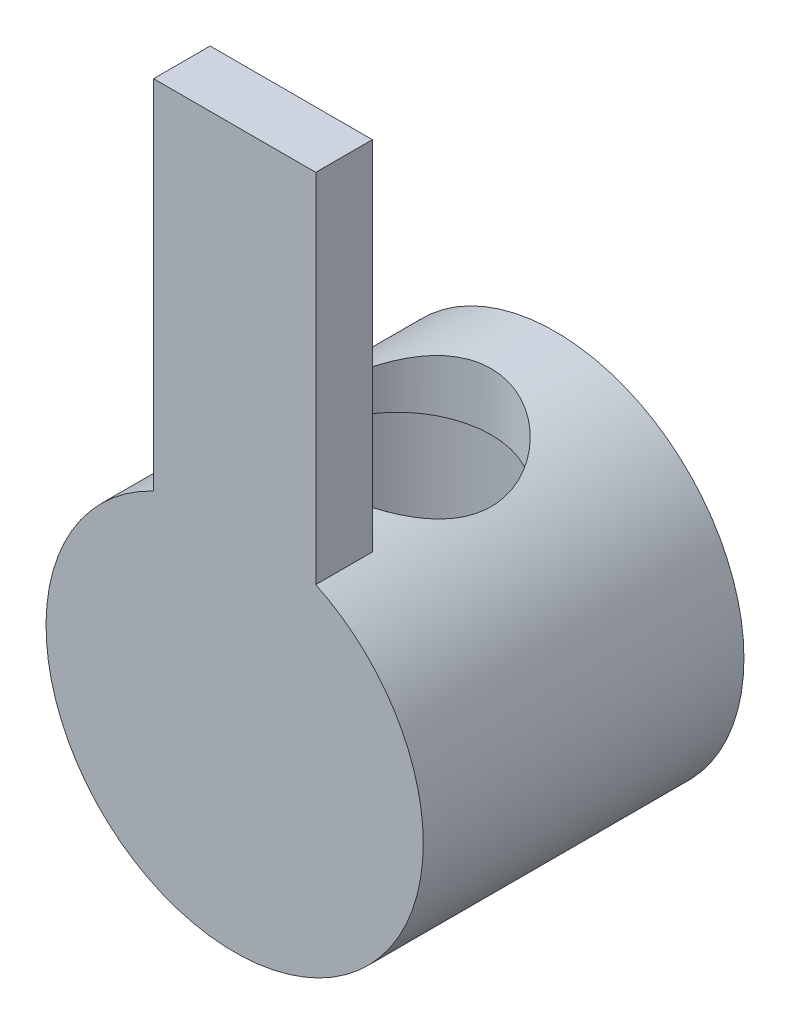
ISO-10303-21;
HEADER;
FILE_DESCRIPTION(('STEP AP214'),'2;1');
FILE_NAME('part.step','',(''),(''),'','','');
FILE_SCHEMA(('AUTOMOTIVE_DESIGN { 1 0 10303 214 1 1 1 1 }'));
ENDSEC;
DATA;
#1=APPLICATION_CONTEXT('core data for automotive mechanical design processes');
#2=APPLICATION_PROTOCOL_DEFINITION('international standard','automotive_design',2000,#1);
#3=PRODUCT_CONTEXT('',#1,'mechanical');
#4=PRODUCT('Part','Part','',(#3));
#5=PRODUCT_RELATED_PRODUCT_CATEGORY('part','',(#4));
#6=PRODUCT_DEFINITION_FORMATION('','',#4);
#7=PRODUCT_DEFINITION_CONTEXT('part definition',#1,'design');
#8=PRODUCT_DEFINITION('design','',#6,#7);
#9=PRODUCT_DEFINITION_SHAPE('','',#8);
#10=(LENGTH_UNIT() NAMED_UNIT(*) SI_UNIT(.MILLI.,.METRE.));
#11=(NAMED_UNIT(*) PLANE_ANGLE_UNIT() SI_UNIT($,.RADIAN.));
#12=(NAMED_UNIT(*) SI_UNIT($,.STERADIAN.) SOLID_ANGLE_UNIT());
#13=UNCERTAINTY_MEASURE_WITH_UNIT(LENGTH_MEASURE(1.E-05),#10,'distance_accuracy_value','');
#14=(GEOMETRIC_REPRESENTATION_CONTEXT(3) GLOBAL_UNCERTAINTY_ASSIGNED_CONTEXT((#13)) GLOBAL_UNIT_ASSIGNED_CONTEXT((#10,
#11,#12)) REPRESENTATION_CONTEXT('',''));
#15=CARTESIAN_POINT('',(0.,0.,0.));
#16=DIRECTION('',(0.,0.,1.));
#17=DIRECTION('',(1.,0.,0.));
#18=AXIS2_PLACEMENT_3D('',#15,#16,#17);
#19=CARTESIAN_POINT('',(0.,-4.98,-7.));
#20=DIRECTION('',(0.,0.,1.));
#21=DIRECTION('',(1.,0.,0.));
#22=AXIS2_PLACEMENT_3D('',#19,#20,#21);
#23=CYLINDRICAL_SURFACE('',#22,5.);
#24=DIRECTION('',(0.,0.,1.));
#25=VECTOR('',#24,1.);
#26=CARTESIAN_POINT('',(2.15,-0.465855562789334,-7.));
#27=LINE('',#26,#25);
#28=CARTESIAN_POINT('',(2.15,-0.465855562789334,1.5));
#29=VERTEX_POINT('',#28);
#30=CARTESIAN_POINT('',(2.15,-0.465855562789334,0.));
#31=VERTEX_POINT('',#30);
#32=EDGE_CURVE('E81',#29,#31,#27,.F.);
#33=ORIENTED_EDGE('',*,*,#32,.F.);
#34=CARTESIAN_POINT('',(0.,-4.98,1.5));
#35=DIRECTION('',(0.,0.,1.));
#36=DIRECTION('',(1.,0.,0.));
#37=AXIS2_PLACEMENT_3D('',#34,#35,#36);
#38=CIRCLE('',#37,5.);
#39=CARTESIAN_POINT('',(-2.15,-0.465855562789334,1.5));
#40=VERTEX_POINT('',#39);
#41=EDGE_CURVE('E84',#40,#29,#38,.T.);
#42=ORIENTED_EDGE('',*,*,#41,.F.);
#43=DIRECTION('',(0.,0.,1.));
#44=VECTOR('',#43,1.);
#45=CARTESIAN_POINT('',(-2.15,-0.465855562789334,-7.));
#46=LINE('',#45,#44);
#47=CARTESIAN_POINT('',(-2.15,-0.465855562789334,0.));
#48=VERTEX_POINT('',#47);
#49=EDGE_CURVE('E87',#48,#40,#46,.T.);
#50=ORIENTED_EDGE('',*,*,#49,.F.);
#51=CARTESIAN_POINT('',(0.,-4.98,0.));
#52=DIRECTION('',(0.,0.,-1.));
#53=DIRECTION('',(-1.,0.,0.));
#54=AXIS2_PLACEMENT_3D('',#51,#52,#53);
#55=CIRCLE('',#54,5.);
#56=EDGE_CURVE('E11',#48,#31,#55,.T.);
#57=ORIENTED_EDGE('',*,*,#56,.T.);
#58=EDGE_LOOP('',(#33,#42,#50,#57));
#59=FACE_BOUND('',#58,.T.);
#60=CARTESIAN_POINT('',(0.,-4.98,-7.));
#61=DIRECTION('',(0.,0.,1.));
#62=DIRECTION('',(1.,0.,0.));
#63=AXIS2_PLACEMENT_3D('',#60,#61,#62);
#64=CIRCLE('',#63,5.);
#65=CARTESIAN_POINT('',(5.,-4.98,-7.));
#66=VERTEX_POINT('',#65);
#67=EDGE_CURVE('E93',#66,#66,#64,.T.);
#68=ORIENTED_EDGE('',*,*,#67,.T.);
#69=EDGE_LOOP('',(#68));
#70=FACE_BOUND('',#69,.T.);
#71=CARTESIAN_POINT('',(0.,0.0200000000000001,-0.3));
#72=CARTESIAN_POINT('',(0.131426682334304,0.0199917755047177,-0.300009669056007));
#73=CARTESIAN_POINT('',(0.263015634437212,0.0147619913527734,-0.31042556177403));
#74=CARTESIAN_POINT('',(0.522301454622882,-0.00564581438980243,-0.35163182116205));
#75=CARTESIAN_POINT('',(0.649990448564105,-0.0208427281232976,-0.38246088092502));
#76=CARTESIAN_POINT('',(0.897333631316203,-0.0595930907752331,-0.462984622718842));
#77=CARTESIAN_POINT('',(1.01701694536277,-0.0831140409274075,-0.512605987782728));
#78=CARTESIAN_POINT('',(1.24618160399671,-0.136355566741728,-0.628926526251796));
#79=CARTESIAN_POINT('',(1.3556637520377,-0.166075653555792,-0.695624353145094));
#80=CARTESIAN_POINT('',(1.56876952630998,-0.231093549493683,-0.848793131642628));
#81=CARTESIAN_POINT('',(1.67163802294308,-0.266620023409093,-0.936216200229782));
#82=CARTESIAN_POINT('',(1.86194861703333,-0.338500742232692,-1.12630369598529));
#83=CARTESIAN_POINT('',(1.94937895911555,-0.374855594331026,-1.22897962884011));
#84=CARTESIAN_POINT('',(2.11312999967247,-0.447526220543785,-1.45620837444528));
#85=CARTESIAN_POINT('',(2.18806333849064,-0.483620325874333,-1.58184024603501));
#86=CARTESIAN_POINT('',(2.31542056761491,-0.54785053056445,-1.84591833979543));
#87=CARTESIAN_POINT('',(2.36786053751682,-0.575992309792079,-1.98435532176262));
#88=CARTESIAN_POINT('',(2.44533110537653,-0.618553324085982,-2.26166276359641));
#89=CARTESIAN_POINT('',(2.47181464267578,-0.633693210415482,-2.40001113017958));
#90=CARTESIAN_POINT('',(2.50106748329741,-0.650452751278497,-2.67994709443761));
#91=CARTESIAN_POINT('',(2.50386022093906,-0.652085766415702,-2.82153135217509));
#92=CARTESIAN_POINT('',(2.48671821792512,-0.642226743570632,-3.08571506079088));
#93=CARTESIAN_POINT('',(2.46946139884055,-0.632280908450156,-3.20856007805829));
#94=CARTESIAN_POINT('',(2.41734962264384,-0.603094281653247,-3.44930477343195));
#95=CARTESIAN_POINT('',(2.38248905974454,-0.583850529205458,-3.56720286326311));
#96=CARTESIAN_POINT('',(2.29552445096459,-0.537813089681611,-3.79807283141433));
#97=CARTESIAN_POINT('',(2.24303766778987,-0.510853983400073,-3.91086599696452));
#98=CARTESIAN_POINT('',(2.12260421917012,-0.452414892964872,-4.12658573147497));
#99=CARTESIAN_POINT('',(2.0546506095312,-0.420932880495225,-4.22950783900021));
#100=CARTESIAN_POINT('',(1.89516513728194,-0.352171052417867,-4.43630313185808));
#101=CARTESIAN_POINT('',(1.80173614592319,-0.314662244081351,-4.5386421839404));
#102=CARTESIAN_POINT('',(1.59888894685344,-0.241309417489813,-4.72683854647725));
#103=CARTESIAN_POINT('',(1.48946314143571,-0.205466201029969,-4.81268798008471));
#104=CARTESIAN_POINT('',(1.25129126457962,-0.137450317925913,-4.96921415257432));
#105=CARTESIAN_POINT('',(1.12188397899853,-0.105525395949848,-5.03900118111436));
#106=CARTESIAN_POINT('',(0.851165538721984,-0.0510529719689147,-5.15524257260752));
#107=CARTESIAN_POINT('',(0.709863940663161,-0.0284980264110671,-5.2017154625379));
#108=CARTESIAN_POINT('',(0.431916229151779,0.00310834353579104,-5.26618850929171));
#109=CARTESIAN_POINT('',(0.295853826370904,0.0131234575324013,-5.286228089367));
#110=CARTESIAN_POINT('',(0.021948999873287,0.0218253364779369,-5.30366182783617));
#111=CARTESIAN_POINT('',(-0.11589254967511,0.0205174680342593,-5.3010667140985));
#112=CARTESIAN_POINT('',(-0.378082429964657,0.00727980633468138,-5.2744832789533));
#113=CARTESIAN_POINT('',(-0.502648520123707,-0.0038188578000769,-5.2521686681756));
#114=CARTESIAN_POINT('',(-0.746017230755973,-0.0344457171247084,-5.18940482026162));
#115=CARTESIAN_POINT('',(-0.864819214231884,-0.0539748416237534,-5.14895358386411));
#116=CARTESIAN_POINT('',(-1.09722152111965,-0.100393714676712,-5.05000383391964));
#117=CARTESIAN_POINT('',(-1.21057599249831,-0.127477955821269,-4.99102237471768));
#118=CARTESIAN_POINT('',(-1.42615340426439,-0.186400642002496,-4.85723116087518));
#119=CARTESIAN_POINT('',(-1.52837157450204,-0.218241110594659,-4.78241466348012));
#120=CARTESIAN_POINT('',(-1.72941922315487,-0.287294466849134,-4.61059893670911));
#121=CARTESIAN_POINT('',(-1.82693019428496,-0.32472787990512,-4.5121428290248));
#122=CARTESIAN_POINT('',(-2.0046408025722,-0.398440210784129,-4.30018712195056));
#123=CARTESIAN_POINT('',(-2.08482846428685,-0.434718315275929,-4.18667720293013));
#124=CARTESIAN_POINT('',(-2.22926978618995,-0.503720194547204,-3.94089086451535));
#125=CARTESIAN_POINT('',(-2.29256373922243,-0.536186760187461,-3.80797183470886));
#126=CARTESIAN_POINT('',(-2.39520706511459,-0.590648192732544,-3.53122483111745));
#127=CARTESIAN_POINT('',(-2.43458729077056,-0.612656544509862,-3.38741118400001));
#128=CARTESIAN_POINT('',(-2.48465421767005,-0.640962474306487,-3.10772444263706));
#129=CARTESIAN_POINT('',(-2.4977324874436,-0.648565413259037,-2.97241436588103));
#130=CARTESIAN_POINT('',(-2.50172288950898,-0.650866134074211,-2.70138233261932));
#131=CARTESIAN_POINT('',(-2.49264462983266,-0.645569509748895,-2.56566058012637));
#132=CARTESIAN_POINT('',(-2.45481530197332,-0.624053448353371,-2.31129124438315));
#133=CARTESIAN_POINT('',(-2.42802074302696,-0.608922636618672,-2.19224881827924));
#134=CARTESIAN_POINT('',(-2.35793843840544,-0.570724596623977,-1.96047970780005));
#135=CARTESIAN_POINT('',(-2.31464538728732,-0.547654815650349,-1.84775506843346));
#136=CARTESIAN_POINT('',(-2.20953919315538,-0.494286735665874,-1.62343784728027));
#137=CARTESIAN_POINT('',(-2.14667719009403,-0.463606920015502,-1.51243014826498));
#138=CARTESIAN_POINT('',(-2.0053780838799,-0.399116729225447,-1.30181375675995));
#139=CARTESIAN_POINT('',(-1.92693287765888,-0.365304730292334,-1.20221103737127));
#140=CARTESIAN_POINT('',(-1.74550556946066,-0.293441836729893,-1.00464463625036));
#141=CARTESIAN_POINT('',(-1.6407002246921,-0.255375084850195,-0.908350635828624));
#142=CARTESIAN_POINT('',(-1.41539785420684,-0.183056526164548,-0.734344150571956));
#143=CARTESIAN_POINT('',(-1.29489242426332,-0.148806780945537,-0.656641681394117));
#144=CARTESIAN_POINT('',(-1.03978808878536,-0.0875485054221799,-0.521903020515898));
#145=CARTESIAN_POINT('',(-0.905095560782287,-0.0605928856251182,-0.46501683221555));
#146=CARTESIAN_POINT('',(-0.69632870925735,-0.0282203907664953,-0.397816141207603));
#147=CARTESIAN_POINT('',(-0.625670413494087,-0.0187768591812594,-0.37844460199819));
#148=CARTESIAN_POINT('',(-0.482623997839256,-0.00282872724899328,-0.345934051629402));
#149=CARTESIAN_POINT('',(-0.4102369630924,0.00367766823158769,-0.332791233323652));
#150=CARTESIAN_POINT('',(-0.281518684621671,0.0123820076612991,-0.315262527715367));
#151=CARTESIAN_POINT('',(-0.225408499555445,0.0152328846645413,-0.309545063468676));
#152=CARTESIAN_POINT('',(-0.112875528456289,0.0190436732965848,-0.301911670534289));
#153=CARTESIAN_POINT('',(-0.0564527338382183,0.0200035327319756,-0.299995846774524));
#154=CARTESIAN_POINT('',(0.,0.0200000000000001,-0.3));
#155=B_SPLINE_CURVE_WITH_KNOTS('',3,(#71,#72,#73,#74,#75,#76,#77,#78,#79,#80,#81,#82,#83,#84,
#85,#86,#87,#88,#89,#90,#91,#92,#93,#94,#95,#96,#97,#98,#99,#100,#101,#102,#103,#104,#105,#106,
#107,#108,#109,#110,#111,#112,#113,#114,#115,#116,#117,#118,#119,#120,#121,#122,#123,#124,#125,
#126,#127,#128,#129,#130,#131,#132,#133,#134,#135,#136,#137,#138,#139,#140,#141,#142,#143,#144,
#145,#146,#147,#148,#149,#150,#151,#152,#153,#154),.UNSPECIFIED.,.T.,.F.,(4,2,2,2,2,2,2,2,2,2,2,
2,2,2,2,2,2,2,2,2,2,2,2,2,2,2,2,2,2,2,2,2,2,2,2,2,2,2,2,2,2,4),(0.,0.394060643550731,
0.788870374272994,1.18215538873075,1.57540940145392,1.99245439679522,2.40981559413509,
2.85954316076882,3.30894869745702,3.73145030350574,4.15353393322551,4.52514281023302,
4.89687009814196,5.27725600421218,5.65781303150554,6.08662353334696,6.51563836496716,
6.96457555536102,7.41315542280699,7.82458226178364,8.2358141127869,8.61517266265305,
8.99457304077329,9.38482140069747,9.77523626870848,10.2039902661037,10.6330397153795,
11.0828670540368,11.53211279863,11.9382326875699,12.3441764966107,12.7114482562151,
13.0788382197025,13.4709114195009,13.8631890285845,14.303131068923,14.7433095845248,
15.1866003415819,15.407934939208,15.6291340766843,15.7983933645035,15.9676573239323),.UNSPECIFIED.);
#156=CARTESIAN_POINT('',(0.,0.0200000000000001,-0.3));
#157=VERTEX_POINT('',#156);
#158=EDGE_CURVE('E94',#157,#157,#155,.T.);
#159=ORIENTED_EDGE('',*,*,#158,.F.);
#160=EDGE_LOOP('',(#159));
#161=FACE_BOUND('',#160,.T.);
#162=CARTESIAN_POINT('',(0.,-9.98,-6.3));
#163=CARTESIAN_POINT('',(-0.0870043522183528,-9.98000042621704,-6.3000004487662));
#164=CARTESIAN_POINT('',(-0.174003012834709,-9.97772447045083,-6.29675153305039));
#165=CARTESIAN_POINT('',(-0.347314194586727,-9.96867770301692,-6.28380921593257));
#166=CARTESIAN_POINT('',(-0.433626465698281,-9.96190532313284,-6.2741135661035));
#167=CARTESIAN_POINT('',(-0.604838270775727,-9.94402806677405,-6.24842866881439));
#168=CARTESIAN_POINT('',(-0.689738047132314,-9.93292394181202,-6.23244051303437));
#169=CARTESIAN_POINT('',(-0.85754161563731,-9.90664718548649,-6.19441276328263));
#170=CARTESIAN_POINT('',(-0.940444537032613,-9.89147281303202,-6.17237057954023));
#171=CARTESIAN_POINT('',(-1.18445169780014,-9.84050384715948,-6.09785253087014));
#172=CARTESIAN_POINT('',(-1.34188511202347,-9.79914978198124,-6.03682584300036));
#173=CARTESIAN_POINT('',(-1.64342226800416,-9.7048504210069,-5.89467791775394));
#174=CARTESIAN_POINT('',(-1.78752406033636,-9.65190343382707,-5.81355374796828));
#175=CARTESIAN_POINT('',(-2.07281883599129,-9.53294999672667,-5.62579220637099));
#176=CARTESIAN_POINT('',(-2.21263077144972,-9.46620313255133,-5.51753427704357));
#177=CARTESIAN_POINT('',(-2.47340994772192,-9.32787986703411,-5.2825640432033));
#178=CARTESIAN_POINT('',(-2.59434841313184,-9.25629632500927,-5.1558241183599));
#179=CARTESIAN_POINT('',(-2.77043321825859,-9.14301906437413,-4.94132054450989));
#180=CARTESIAN_POINT('',(-2.83217300660939,-9.10114814248979,-4.85898169346834));
#181=CARTESIAN_POINT('',(-2.94845109279401,-9.01877741040551,-4.68872460640466));
#182=CARTESIAN_POINT('',(-3.00298752227157,-8.97827795794519,-4.60080493158868));
#183=CARTESIAN_POINT('',(-3.15511672851824,-8.86091849381853,-4.32912090095759));
#184=CARTESIAN_POINT('',(-3.24158145123197,-8.78795944870695,-4.13700559977639));
#185=CARTESIAN_POINT('',(-3.3583150253545,-8.68483812483702,-3.79661450580312));
#186=CARTESIAN_POINT('',(-3.39769929206986,-8.64842434173771,-3.65333285618598));
#187=CARTESIAN_POINT('',(-3.45814142842493,-8.59151026705735,-3.35997827748747));
#188=CARTESIAN_POINT('',(-3.47923517471286,-8.57097883101039,-3.20991925353472));
#189=CARTESIAN_POINT('',(-3.50172630314739,-8.54906148275634,-2.90600448544446));
#190=CARTESIAN_POINT('',(-3.50301074075767,-8.547785357308,-2.75213197647381));
#191=CARTESIAN_POINT('',(-3.48547905206289,-8.56490716922728,-2.44660694102338));
#192=CARTESIAN_POINT('',(-3.46664910102171,-8.58331863800168,-2.29495601411412));
#193=CARTESIAN_POINT('',(-3.41217455094726,-8.63490422743524,-2.00817200267927));
#194=CARTESIAN_POINT('',(-3.37772210034564,-8.66702349344459,-1.87260939704024));
#195=CARTESIAN_POINT('',(-3.29410841442847,-8.74191452361164,-1.60921270160592));
#196=CARTESIAN_POINT('',(-3.24493538684719,-8.78469482342135,-1.48138490702493));
#197=CARTESIAN_POINT('',(-3.10362288773558,-8.9017035825872,-1.16886964142902));
#198=CARTESIAN_POINT('',(-3.00252401271628,-8.98058241582138,-0.989954299899197));
#199=CARTESIAN_POINT('',(-2.77217358887505,-9.14353835198786,-0.653675150064162));
#200=CARTESIAN_POINT('',(-2.64286478640501,-9.22762577382756,-0.496356246604585));
#201=CARTESIAN_POINT('',(-2.35615009551439,-9.39319719993645,-0.20365852261563));
#202=CARTESIAN_POINT('',(-2.19842810008499,-9.47463830430187,-0.068563131787045));
#203=CARTESIAN_POINT('',(-1.85792737623171,-9.62571074856638,0.173471624770356));
#204=CARTESIAN_POINT('',(-1.67520180814532,-9.69536646098565,0.280469356794738));
#205=CARTESIAN_POINT('',(-1.33103347938957,-9.80216631911686,0.44130041452208));
#206=CARTESIAN_POINT('',(-1.17381323782198,-9.84309351042242,0.501657347755492));
#207=CARTESIAN_POINT('',(-0.849391818622392,-9.9101001158466,0.599584431341268));
#208=CARTESIAN_POINT('',(-0.682197524634622,-9.93618964221844,0.637170102042487));
#209=CARTESIAN_POINT('',(-0.341601582307257,-9.97126408812027,0.687556300422786));
#210=CARTESIAN_POINT('',(-0.168177620339831,-9.98017960470658,0.700256264493287));
#211=CARTESIAN_POINT('',(0.178615477776579,-9.97981494790606,0.699735953508333));
#212=CARTESIAN_POINT('',(0.351984616048673,-9.9705355966193,0.686516849556082));
#213=CARTESIAN_POINT('',(0.681878691052434,-9.93588308246295,0.636722828531956));
#214=CARTESIAN_POINT('',(0.838764541823671,-9.91159966844545,0.601728333681923));
#215=CARTESIAN_POINT('',(1.14387617411517,-9.84988673925569,0.511626699332259));
#216=CARTESIAN_POINT('',(1.29210033422851,-9.81245477190368,0.456515808088553));
#217=CARTESIAN_POINT('',(1.58733800015477,-9.72402407105281,0.323841485576615));
#218=CARTESIAN_POINT('',(1.7335252380801,-9.67225335349562,0.244966278016553));
#219=CARTESIAN_POINT('',(2.0110620530274,-9.5601824682401,0.0692594588006431));
#220=CARTESIAN_POINT('',(2.14240222019462,-9.49987694522203,-0.0275834389659505));
#221=CARTESIAN_POINT('',(2.41023390883475,-9.3637210249878,-0.255060417458972));
#222=CARTESIAN_POINT('',(2.54376778669947,-9.28697559366364,-0.388640973431261));
#223=CARTESIAN_POINT('',(2.78779809474485,-9.1331901996123,-0.675457208472606));
#224=CARTESIAN_POINT('',(2.8982762699034,-9.05615005231017,-0.828708308386421));
#225=CARTESIAN_POINT('',(3.0850074812227,-8.91636847825759,-1.13802253008649));
#226=CARTESIAN_POINT('',(3.1635242228457,-8.85296424128969,-1.29241256766717));
#227=CARTESIAN_POINT('',(3.29796239328923,-8.73915149445731,-1.61515522954211));
#228=CARTESIAN_POINT('',(3.35392797233398,-8.68871766214846,-1.7834797861746));
#229=CARTESIAN_POINT('',(3.43149310287235,-8.61690600243934,-2.09623456971939));
#230=CARTESIAN_POINT('',(3.45775440021167,-8.59171423380863,-2.23861024263528));
#231=CARTESIAN_POINT('',(3.4923883051313,-8.55824517387988,-2.52741342236617));
#232=CARTESIAN_POINT('',(3.50078409856961,-8.54994596002658,-2.67383542739967));
#233=CARTESIAN_POINT('',(3.49909888334034,-8.55159716695881,-2.96664018096044));
#234=CARTESIAN_POINT('',(3.48899567350594,-8.56156951596319,-3.11302267117486));
#235=CARTESIAN_POINT('',(3.45102053266417,-8.5981648508262,-3.40140350911802));
#236=CARTESIAN_POINT('',(3.42312265276601,-8.62481215168134,-3.54339513634927));
#237=CARTESIAN_POINT('',(3.34096227925005,-8.70046646887593,-3.85904579594944));
#238=CARTESIAN_POINT('',(3.28147777563187,-8.75366378114439,-4.03031707289682));
#239=CARTESIAN_POINT('',(3.13919427182786,-8.87281979106864,-4.3580463909688));
#240=CARTESIAN_POINT('',(3.05635903921881,-8.93879827060255,-4.51448090228004));
#241=CARTESIAN_POINT('',(2.8673990402521,-9.0778200574564,-4.81501066618497));
#242=CARTESIAN_POINT('',(2.76076710805705,-9.15099409346797,-4.95872384213235));
#243=CARTESIAN_POINT('',(2.52666411670164,-9.29682488642116,-5.22854887985515));
#244=CARTESIAN_POINT('',(2.39918616499751,-9.36948146395,-5.3546548943326));
#245=CARTESIAN_POINT('',(2.18058687186094,-9.48037637833506,-5.53978101259955));
#246=CARTESIAN_POINT('',(2.09580486228962,-9.52058015716468,-5.60520525502232));
#247=CARTESIAN_POINT('',(1.91963184498311,-9.59781861454198,-5.72857779429437));
#248=CARTESIAN_POINT('',(1.82824370796615,-9.63485465454824,-5.78652930832996));
#249=CARTESIAN_POINT('',(1.63930910148072,-9.70470170576152,-5.89426648887701));
#250=CARTESIAN_POINT('',(1.54176605451268,-9.73751503472715,-5.94405663913574));
#251=CARTESIAN_POINT('',(1.34109196004992,-9.79792906327276,-6.03474651453536));
#252=CARTESIAN_POINT('',(1.23796250088363,-9.82553123458168,-6.07564875028463));
#253=CARTESIAN_POINT('',(1.04286308882553,-9.87090028372523,-6.14236569813154));
#254=CARTESIAN_POINT('',(0.951550304699075,-9.88952223595846,-6.1695247435984));
#255=CARTESIAN_POINT('',(0.766197984405042,-9.92184014789704,-6.2164417179692));
#256=CARTESIAN_POINT('',(0.672159051937782,-9.93553718934472,-6.23620127218949));
#257=CARTESIAN_POINT('',(0.482256943579392,-9.95760550276436,-6.26795137158305));
#258=CARTESIAN_POINT('',(0.386395698505666,-9.96598211980299,-6.27994971413918));
#259=CARTESIAN_POINT('',(0.193687228275467,-9.97717889255552,-6.29597343613781));
#260=CARTESIAN_POINT('',(0.0968400885386277,-9.97999952559964,-6.29999950050133));
#261=CARTESIAN_POINT('',(0.,-9.98,-6.3));
#262=B_SPLINE_CURVE_WITH_KNOTS('',3,(#162,#163,#164,#165,#166,#167,#168,#169,#170,#171,#172,
#173,#174,#175,#176,#177,#178,#179,#180,#181,#182,#183,#184,#185,#186,#187,#188,#189,#190,#191,
#192,#193,#194,#195,#196,#197,#198,#199,#200,#201,#202,#203,#204,#205,#206,#207,#208,#209,#210,
#211,#212,#213,#214,#215,#216,#217,#218,#219,#220,#221,#222,#223,#224,#225,#226,#227,#228,#229,
#230,#231,#232,#233,#234,#235,#236,#237,#238,#239,#240,#241,#242,#243,#244,#245,#246,#247,#248,
#249,#250,#251,#252,#253,#254,#255,#256,#257,#258,#259,#260,#261),.UNSPECIFIED.,.T.,.F.,(4,2,2,
2,2,2,2,2,2,2,2,2,2,2,2,2,2,2,2,2,2,2,2,2,2,2,2,2,2,2,2,2,2,2,2,2,2,2,2,2,2,2,2,2,2,2,2,2,2,4),
(0.,0.260913186666067,0.52191741977439,0.782876391488196,1.04394716964421,1.56298190958995,
2.08209242616793,2.64705237592498,3.21286544833364,3.54582584040706,3.87887242451091,
4.54318175364801,5.00048193722639,5.4568830893327,5.91588549736315,6.37520358351763,
6.80419814677738,7.23353729006888,7.8904312594482,8.54867104526662,9.21474554480325,
9.87942528554155,10.3971938189047,10.9146090554214,11.4341108995647,11.953589271558,
12.439168070614,12.9248374772987,13.4448388395999,13.965167944917,14.574447250411,
15.1842071553651,15.7356049750207,16.2859179716953,16.724907060709,17.1633260811637,
17.6022716053507,18.0418586851689,18.605647020095,19.1703150249751,19.7484161780972,
20.3267088629478,20.6694660014279,21.0120750786385,21.3544952953889,21.6968186610904,
21.9876091670431,22.2783357626328,22.5687698211746,22.8591789266206),.UNSPECIFIED.);
#263=CARTESIAN_POINT('',(0.,-9.98,-6.3));
#264=VERTEX_POINT('',#263);
#265=EDGE_CURVE('E37',#264,#264,#262,.T.);
#266=ORIENTED_EDGE('',*,*,#265,.T.);
#267=EDGE_LOOP('',(#266));
#268=FACE_BOUND('',#267,.T.);
#269=ADVANCED_FACE('F33',(#59,#70,#161,#268),#23,.T.);
#270=CARTESIAN_POINT('',(2.15,-9.,1.5));
#271=DIRECTION('',(-1.,0.,0.));
#272=DIRECTION('',(0.,0.,1.));
#273=AXIS2_PLACEMENT_3D('',#270,#271,#272);
#274=PLANE('',#273);
#275=DIRECTION('',(0.,1.,0.));
#276=VECTOR('',#275,1.);
#277=CARTESIAN_POINT('',(2.15,-9.,1.5));
#278=LINE('',#277,#276);
#279=CARTESIAN_POINT('',(2.15,9.,1.5));
#280=VERTEX_POINT('',#279);
#281=EDGE_CURVE('E90',#29,#280,#278,.T.);
#282=ORIENTED_EDGE('',*,*,#281,.F.);
#283=ORIENTED_EDGE('',*,*,#32,.T.);
#284=DIRECTION('',(0.,1.,0.));
#285=VECTOR('',#284,1.);
#286=CARTESIAN_POINT('',(2.15,-9.,0.));
#287=LINE('',#286,#285);
#288=CARTESIAN_POINT('',(2.15,9.,0.));
#289=VERTEX_POINT('',#288);
#290=EDGE_CURVE('E67',#31,#289,#287,.T.);
#291=ORIENTED_EDGE('',*,*,#290,.T.);
#292=DIRECTION('',(0.,0.,-1.));
#293=VECTOR('',#292,1.);
#294=CARTESIAN_POINT('',(2.15,9.,1.5));
#295=LINE('',#294,#293);
#296=EDGE_CURVE('E47',#280,#289,#295,.T.);
#297=ORIENTED_EDGE('',*,*,#296,.F.);
#298=EDGE_LOOP('',(#282,#283,#291,#297));
#299=FACE_BOUND('',#298,.T.);
#300=ADVANCED_FACE('F35',(#299),#274,.F.);
#301=CARTESIAN_POINT('',(-2.15,9.,1.5));
#302=DIRECTION('',(0.,-1.,0.));
#303=DIRECTION('',(0.,0.,-1.));
#304=AXIS2_PLACEMENT_3D('',#301,#302,#303);
#305=PLANE('',#304);
#306=DIRECTION('',(-1.,0.,0.));
#307=VECTOR('',#306,1.);
#308=CARTESIAN_POINT('',(-2.15,9.,0.));
#309=LINE('',#308,#307);
#310=CARTESIAN_POINT('',(-2.15,9.,0.));
#311=VERTEX_POINT('',#310);
#312=EDGE_CURVE('E101',#289,#311,#309,.T.);
#313=ORIENTED_EDGE('',*,*,#312,.T.);
#314=DIRECTION('',(0.,0.,-1.));
#315=VECTOR('',#314,1.);
#316=CARTESIAN_POINT('',(-2.15,9.,1.5));
#317=LINE('',#316,#315);
#318=CARTESIAN_POINT('',(-2.15,9.,1.5));
#319=VERTEX_POINT('',#318);
#320=EDGE_CURVE('E106',#319,#311,#317,.T.);
#321=ORIENTED_EDGE('',*,*,#320,.F.);
#322=DIRECTION('',(-1.,0.,0.));
#323=VECTOR('',#322,1.);
#324=CARTESIAN_POINT('',(-2.15,9.,1.5));
#325=LINE('',#324,#323);
#326=EDGE_CURVE('E56',#280,#319,#325,.T.);
#327=ORIENTED_EDGE('',*,*,#326,.F.);
#328=ORIENTED_EDGE('',*,*,#296,.T.);
#329=EDGE_LOOP('',(#313,#321,#327,#328));
#330=FACE_BOUND('',#329,.T.);
#331=ADVANCED_FACE('F142',(#330),#305,.F.);
#332=CARTESIAN_POINT('',(-2.15,-9.,1.5));
#333=DIRECTION('',(1.,0.,0.));
#334=DIRECTION('',(0.,0.,-1.));
#335=AXIS2_PLACEMENT_3D('',#332,#333,#334);
#336=PLANE('',#335);
#337=DIRECTION('',(0.,-1.,0.));
#338=VECTOR('',#337,1.);
#339=CARTESIAN_POINT('',(-2.15,-9.,0.));
#340=LINE('',#339,#338);
#341=EDGE_CURVE('E97',#311,#48,#340,.T.);
#342=ORIENTED_EDGE('',*,*,#341,.T.);
#343=ORIENTED_EDGE('',*,*,#49,.T.);
#344=DIRECTION('',(0.,-1.,0.));
#345=VECTOR('',#344,1.);
#346=CARTESIAN_POINT('',(-2.15,-9.,1.5));
#347=LINE('',#346,#345);
#348=EDGE_CURVE('E92',#319,#40,#347,.T.);
#349=ORIENTED_EDGE('',*,*,#348,.F.);
#350=ORIENTED_EDGE('',*,*,#320,.T.);
#351=EDGE_LOOP('',(#342,#343,#349,#350));
#352=FACE_BOUND('',#351,.T.);
#353=ADVANCED_FACE('F146',(#352),#336,.F.);
#354=CARTESIAN_POINT('',(2.15,9.,1.5));
#355=DIRECTION('',(0.,0.,-1.));
#356=DIRECTION('',(-1.,0.,0.));
#357=AXIS2_PLACEMENT_3D('',#354,#355,#356);
#358=PLANE('',#357);
#359=ORIENTED_EDGE('',*,*,#41,.T.);
#360=ORIENTED_EDGE('',*,*,#281,.T.);
#361=ORIENTED_EDGE('',*,*,#326,.T.);
#362=ORIENTED_EDGE('',*,*,#348,.T.);
#363=EDGE_LOOP('',(#359,#360,#361,#362));
#364=FACE_BOUND('',#363,.T.);
#365=ADVANCED_FACE('F89',(#364),#358,.F.);
#366=CARTESIAN_POINT('',(2.15,9.,0.));
#367=DIRECTION('',(0.,0.,-1.));
#368=DIRECTION('',(-1.,0.,0.));
#369=AXIS2_PLACEMENT_3D('',#366,#367,#368);
#370=PLANE('',#369);
#371=ORIENTED_EDGE('',*,*,#56,.F.);
#372=ORIENTED_EDGE('',*,*,#341,.F.);
#373=ORIENTED_EDGE('',*,*,#312,.F.);
#374=ORIENTED_EDGE('',*,*,#290,.F.);
#375=EDGE_LOOP('',(#371,#372,#373,#374));
#376=FACE_BOUND('',#375,.T.);
#377=ADVANCED_FACE('F130',(#376),#370,.T.);
#378=CARTESIAN_POINT('',(0.,-4.98,-7.));
#379=DIRECTION('',(0.,0.,1.));
#380=DIRECTION('',(1.,0.,0.));
#381=AXIS2_PLACEMENT_3D('',#378,#379,#380);
#382=PLANE('',#381);
#383=ORIENTED_EDGE('',*,*,#67,.F.);
#384=EDGE_LOOP('',(#383));
#385=FACE_BOUND('',#384,.T.);
#386=ADVANCED_FACE('F124',(#385),#382,.F.);
#387=CARTESIAN_POINT('',(0.,-9.98,-2.8));
#388=DIRECTION('',(0.,1.,0.));
#389=DIRECTION('',(0.,0.,1.));
#390=AXIS2_PLACEMENT_3D('',#387,#388,#389);
#391=CYLINDRICAL_SURFACE('',#390,2.5);
#392=CARTESIAN_POINT('',(0.,-1.5,-2.8));
#393=DIRECTION('',(0.,1.,0.));
#394=DIRECTION('',(0.,0.,1.));
#395=AXIS2_PLACEMENT_3D('',#392,#393,#394);
#396=CIRCLE('',#395,2.5);
#397=CARTESIAN_POINT('',(0.,-1.5,-0.3));
#398=VERTEX_POINT('',#397);
#399=EDGE_CURVE('E116',#398,#398,#396,.F.);
#400=ORIENTED_EDGE('',*,*,#399,.T.);
#401=EDGE_LOOP('',(#400));
#402=FACE_BOUND('',#401,.T.);
#403=ORIENTED_EDGE('',*,*,#158,.T.);
#404=EDGE_LOOP('',(#403));
#405=FACE_BOUND('',#404,.T.);
#406=ADVANCED_FACE('F120',(#402,#405),#391,.F.);
#407=CARTESIAN_POINT('',(0.,-1.5,-2.8));
#408=DIRECTION('',(0.,1.,0.));
#409=DIRECTION('',(0.,0.,1.));
#410=AXIS2_PLACEMENT_3D('',#407,#408,#409);
#411=PLANE('',#410);
#412=CARTESIAN_POINT('',(0.,-1.5,-2.8));
#413=DIRECTION('',(0.,1.,0.));
#414=DIRECTION('',(0.,0.,1.));
#415=AXIS2_PLACEMENT_3D('',#412,#413,#414);
#416=CIRCLE('',#415,3.5);
#417=CARTESIAN_POINT('',(0.,-1.5,0.7));
#418=VERTEX_POINT('',#417);
#419=EDGE_CURVE('E202',#418,#418,#416,.T.);
#420=ORIENTED_EDGE('',*,*,#419,.F.);
#421=EDGE_LOOP('',(#420));
#422=FACE_BOUND('',#421,.T.);
#423=ORIENTED_EDGE('',*,*,#399,.F.);
#424=EDGE_LOOP('',(#423));
#425=FACE_BOUND('',#424,.T.);
#426=ADVANCED_FACE('F123',(#422,#425),#411,.F.);
#427=CARTESIAN_POINT('',(0.,-1.5,-2.8));
#428=DIRECTION('',(0.,-1.,0.));
#429=DIRECTION('',(0.,0.,-1.));
#430=AXIS2_PLACEMENT_3D('',#427,#428,#429);
#431=CYLINDRICAL_SURFACE('',#430,3.5);
#432=ORIENTED_EDGE('',*,*,#265,.F.);
#433=EDGE_LOOP('',(#432));
#434=FACE_BOUND('',#433,.T.);
#435=ORIENTED_EDGE('',*,*,#419,.T.);
#436=EDGE_LOOP('',(#435));
#437=FACE_BOUND('',#436,.T.);
#438=ADVANCED_FACE('F126',(#434,#437),#431,.F.);
#439=CLOSED_SHELL('',(#269,#300,#331,#353,#365,#377,#386,#406,#426,#438));
#440=MANIFOLD_SOLID_BREP('B2',#439);
#441=ADVANCED_BREP_SHAPE_REPRESENTATION('',(#18,#440),#14);
#442=SHAPE_DEFINITION_REPRESENTATION(#9,#441);
ENDSEC;
END-ISO-10303-21;
